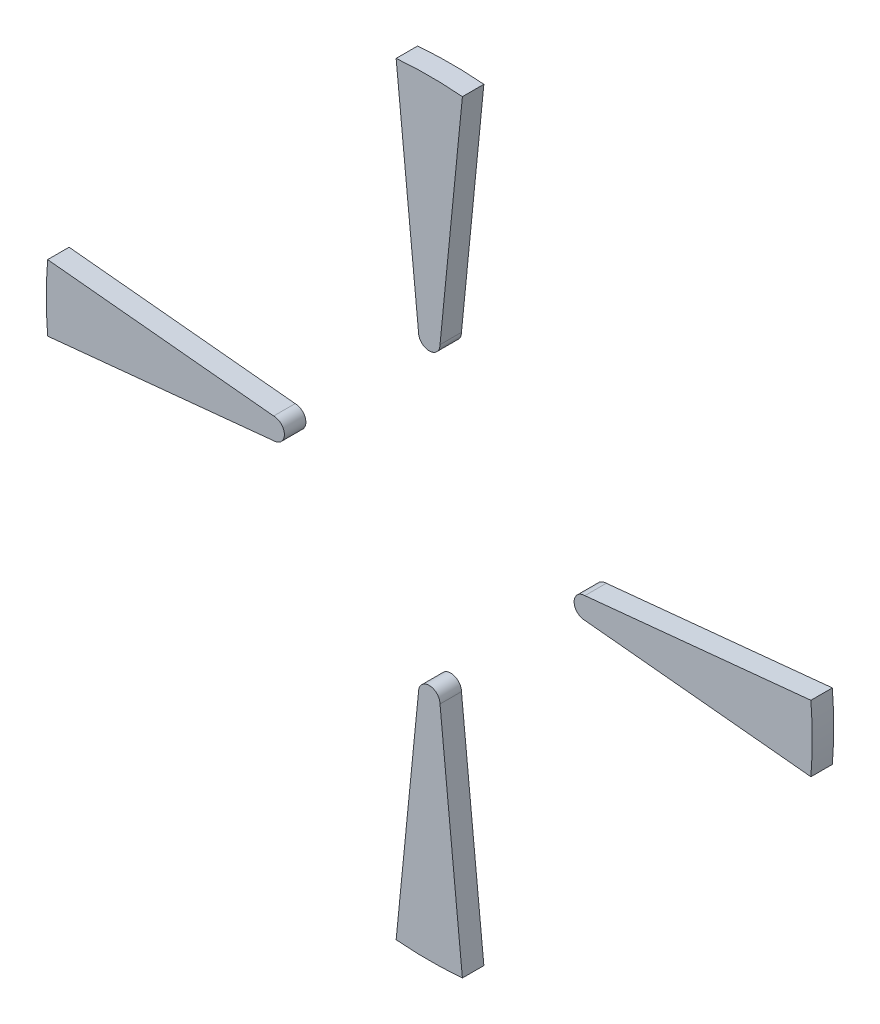
ISO-10303-21;
HEADER;
FILE_DESCRIPTION(('STEP AP214'),'2;1');
FILE_NAME('part.step','',(''),(''),'','','');
FILE_SCHEMA(('AUTOMOTIVE_DESIGN { 1 0 10303 214 1 1 1 1 }'));
ENDSEC;
DATA;
#1=APPLICATION_CONTEXT('core data for automotive mechanical design processes');
#2=APPLICATION_PROTOCOL_DEFINITION('international standard','automotive_design',2000,#1);
#3=PRODUCT_CONTEXT('',#1,'mechanical');
#4=PRODUCT('Part','Part','',(#3));
#5=PRODUCT_RELATED_PRODUCT_CATEGORY('part','',(#4));
#6=PRODUCT_DEFINITION_FORMATION('','',#4);
#7=PRODUCT_DEFINITION_CONTEXT('part definition',#1,'design');
#8=PRODUCT_DEFINITION('design','',#6,#7);
#9=PRODUCT_DEFINITION_SHAPE('','',#8);
#10=(LENGTH_UNIT() NAMED_UNIT(*) SI_UNIT(.MILLI.,.METRE.));
#11=(NAMED_UNIT(*) PLANE_ANGLE_UNIT() SI_UNIT($,.RADIAN.));
#12=(NAMED_UNIT(*) SI_UNIT($,.STERADIAN.) SOLID_ANGLE_UNIT());
#13=UNCERTAINTY_MEASURE_WITH_UNIT(LENGTH_MEASURE(1.E-05),#10,'distance_accuracy_value','');
#14=(GEOMETRIC_REPRESENTATION_CONTEXT(3) GLOBAL_UNCERTAINTY_ASSIGNED_CONTEXT((#13)) GLOBAL_UNIT_ASSIGNED_CONTEXT((#10,
#11,#12)) REPRESENTATION_CONTEXT('',''));
#15=CARTESIAN_POINT('',(0.,0.,0.));
#16=DIRECTION('',(0.,0.,1.));
#17=DIRECTION('',(1.,0.,0.));
#18=AXIS2_PLACEMENT_3D('',#15,#16,#17);
#19=CARTESIAN_POINT('',(0.00128687487735684,-0.0129845408163198,0.06));
#20=DIRECTION('',(-0.0986250457590006,0.995124665732407,0.));
#21=DIRECTION('',(-0.995124665732407,-0.0986250457590006,0.));
#22=AXIS2_PLACEMENT_3D('',#19,#20,#21);
#23=PLANE('',#22);
#24=DIRECTION('',(0.995124665732407,0.0986250457590006,0.));
#25=VECTOR('',#24,1.);
#26=CARTESIAN_POINT('',(0.00128687487735684,-0.0129845408163198,0.));
#27=LINE('',#26,#25);
#28=CARTESIAN_POINT('',(0.434999999999999,0.0299999999999985,0.));
#29=VERTEX_POINT('',#28);
#30=CARTESIAN_POINT('',(1.06700404554806,0.0926368032654223,0.));
#31=VERTEX_POINT('',#30);
#32=EDGE_CURVE('E113',#29,#31,#27,.T.);
#33=ORIENTED_EDGE('',*,*,#32,.F.);
#34=DIRECTION('',(0.,0.,-1.));
#35=VECTOR('',#34,1.);
#36=CARTESIAN_POINT('',(0.434999999999999,0.0299999999999985,0.06));
#37=LINE('',#36,#35);
#38=CARTESIAN_POINT('',(0.434999999999999,0.0299999999999985,0.06));
#39=VERTEX_POINT('',#38);
#40=EDGE_CURVE('E12',#39,#29,#37,.T.);
#41=ORIENTED_EDGE('',*,*,#40,.F.);
#42=DIRECTION('',(0.995124665732407,0.0986250457590006,0.));
#43=VECTOR('',#42,1.);
#44=CARTESIAN_POINT('',(0.00128687487735684,-0.0129845408163198,0.06));
#45=LINE('',#44,#43);
#46=CARTESIAN_POINT('',(1.06700404554806,0.0926368032654223,0.06));
#47=VERTEX_POINT('',#46);
#48=EDGE_CURVE('E101',#39,#47,#45,.T.);
#49=ORIENTED_EDGE('',*,*,#48,.T.);
#50=DIRECTION('',(0.,0.,-1.));
#51=VECTOR('',#50,1.);
#52=CARTESIAN_POINT('',(1.06700404554806,0.0926368032654223,0.06));
#53=LINE('',#52,#51);
#54=EDGE_CURVE('E90',#47,#31,#53,.T.);
#55=ORIENTED_EDGE('',*,*,#54,.T.);
#56=EDGE_LOOP('',(#33,#41,#49,#55));
#57=FACE_BOUND('',#56,.T.);
#58=ADVANCED_FACE('F51',(#57),#23,.T.);
#59=CARTESIAN_POINT('',(0.434999999999999,0.,0.06));
#60=DIRECTION('',(0.,0.,-1.));
#61=DIRECTION('',(-1.,0.,0.));
#62=AXIS2_PLACEMENT_3D('',#59,#60,#61);
#63=CYLINDRICAL_SURFACE('',#62,0.03);
#64=CARTESIAN_POINT('',(0.434999999999999,0.,0.));
#65=DIRECTION('',(0.,0.,1.));
#66=DIRECTION('',(1.,0.,0.));
#67=AXIS2_PLACEMENT_3D('',#64,#65,#66);
#68=CIRCLE('',#67,0.03);
#69=CARTESIAN_POINT('',(0.434999999999999,-0.0300000000000015,0.));
#70=VERTEX_POINT('',#69);
#71=EDGE_CURVE('E106',#29,#70,#68,.T.);
#72=ORIENTED_EDGE('',*,*,#71,.T.);
#73=DIRECTION('',(0.,0.,-1.));
#74=VECTOR('',#73,1.);
#75=CARTESIAN_POINT('',(0.434999999999999,-0.0300000000000015,0.06));
#76=LINE('',#75,#74);
#77=CARTESIAN_POINT('',(0.434999999999999,-0.0300000000000015,0.06));
#78=VERTEX_POINT('',#77);
#79=EDGE_CURVE('E59',#78,#70,#76,.T.);
#80=ORIENTED_EDGE('',*,*,#79,.F.);
#81=CARTESIAN_POINT('',(0.434999999999999,0.,0.06));
#82=DIRECTION('',(0.,0.,1.));
#83=DIRECTION('',(1.,0.,0.));
#84=AXIS2_PLACEMENT_3D('',#81,#82,#83);
#85=CIRCLE('',#84,0.03);
#86=EDGE_CURVE('E96',#39,#78,#85,.T.);
#87=ORIENTED_EDGE('',*,*,#86,.F.);
#88=ORIENTED_EDGE('',*,*,#40,.T.);
#89=EDGE_LOOP('',(#72,#80,#87,#88));
#90=FACE_BOUND('',#89,.T.);
#91=ADVANCED_FACE('F104',(#90),#63,.T.);
#92=CARTESIAN_POINT('',(0.00128687487735693,0.0129845408163198,0.06));
#93=DIRECTION('',(0.0986250457590075,0.995124665732406,0.));
#94=DIRECTION('',(-0.995124665732407,0.0986250457590076,0.));
#95=AXIS2_PLACEMENT_3D('',#92,#93,#94);
#96=PLANE('',#95);
#97=DIRECTION('',(0.995124665732407,-0.0986250457590076,0.));
#98=VECTOR('',#97,1.);
#99=CARTESIAN_POINT('',(0.00128687487735693,0.0129845408163198,0.));
#100=LINE('',#99,#98);
#101=CARTESIAN_POINT('',(1.06700404554806,-0.0926368032654298,0.));
#102=VERTEX_POINT('',#101);
#103=EDGE_CURVE('E83',#70,#102,#100,.T.);
#104=ORIENTED_EDGE('',*,*,#103,.T.);
#105=DIRECTION('',(0.,0.,-1.));
#106=VECTOR('',#105,1.);
#107=CARTESIAN_POINT('',(1.06700404554806,-0.0926368032654298,0.06));
#108=LINE('',#107,#106);
#109=CARTESIAN_POINT('',(1.06700404554806,-0.0926368032654298,0.06));
#110=VERTEX_POINT('',#109);
#111=EDGE_CURVE('E107',#110,#102,#108,.T.);
#112=ORIENTED_EDGE('',*,*,#111,.F.);
#113=DIRECTION('',(0.995124665732407,-0.0986250457590076,0.));
#114=VECTOR('',#113,1.);
#115=CARTESIAN_POINT('',(0.00128687487735693,0.0129845408163198,0.06));
#116=LINE('',#115,#114);
#117=EDGE_CURVE('E100',#78,#110,#116,.T.);
#118=ORIENTED_EDGE('',*,*,#117,.F.);
#119=ORIENTED_EDGE('',*,*,#79,.T.);
#120=EDGE_LOOP('',(#104,#112,#118,#119));
#121=FACE_BOUND('',#120,.T.);
#122=ADVANCED_FACE('F108',(#121),#96,.F.);
#123=CARTESIAN_POINT('',(0.,0.,0.06));
#124=DIRECTION('',(0.,0.,-1.));
#125=DIRECTION('',(-1.,0.,0.));
#126=AXIS2_PLACEMENT_3D('',#123,#124,#125);
#127=CYLINDRICAL_SURFACE('',#126,1.07101783857001);
#128=CARTESIAN_POINT('',(0.,0.,0.));
#129=DIRECTION('',(0.,0.,1.));
#130=DIRECTION('',(1.,0.,0.));
#131=AXIS2_PLACEMENT_3D('',#128,#129,#130);
#132=CIRCLE('',#131,1.07101783857001);
#133=EDGE_CURVE('E118',#102,#31,#132,.T.);
#134=ORIENTED_EDGE('',*,*,#133,.T.);
#135=ORIENTED_EDGE('',*,*,#54,.F.);
#136=CARTESIAN_POINT('',(0.,0.,0.06));
#137=DIRECTION('',(0.,0.,1.));
#138=DIRECTION('',(1.,0.,0.));
#139=AXIS2_PLACEMENT_3D('',#136,#137,#138);
#140=CIRCLE('',#139,1.07101783857001);
#141=EDGE_CURVE('E67',#110,#47,#140,.T.);
#142=ORIENTED_EDGE('',*,*,#141,.F.);
#143=ORIENTED_EDGE('',*,*,#111,.T.);
#144=EDGE_LOOP('',(#134,#135,#142,#143));
#145=FACE_BOUND('',#144,.T.);
#146=ADVANCED_FACE('F123',(#145),#127,.T.);
#147=CARTESIAN_POINT('',(0.,0.,0.06));
#148=DIRECTION('',(0.,0.,1.));
#149=DIRECTION('',(1.,0.,0.));
#150=AXIS2_PLACEMENT_3D('',#147,#148,#149);
#151=PLANE('',#150);
#152=ORIENTED_EDGE('',*,*,#48,.F.);
#153=ORIENTED_EDGE('',*,*,#86,.T.);
#154=ORIENTED_EDGE('',*,*,#117,.T.);
#155=ORIENTED_EDGE('',*,*,#141,.T.);
#156=EDGE_LOOP('',(#152,#153,#154,#155));
#157=FACE_BOUND('',#156,.T.);
#158=ADVANCED_FACE('F98',(#157),#151,.T.);
#159=CARTESIAN_POINT('',(0.,0.,0.));
#160=DIRECTION('',(0.,0.,1.));
#161=DIRECTION('',(1.,0.,0.));
#162=AXIS2_PLACEMENT_3D('',#159,#160,#161);
#163=PLANE('',#162);
#164=ORIENTED_EDGE('',*,*,#32,.T.);
#165=ORIENTED_EDGE('',*,*,#133,.F.);
#166=ORIENTED_EDGE('',*,*,#103,.F.);
#167=ORIENTED_EDGE('',*,*,#71,.F.);
#168=EDGE_LOOP('',(#164,#165,#166,#167));
#169=FACE_BOUND('',#168,.T.);
#170=ADVANCED_FACE('F125',(#169),#163,.F.);
#171=CLOSED_SHELL('',(#58,#91,#122,#146,#158,#170));
#172=MANIFOLD_SOLID_BREP('B2',#171);
#173=CARTESIAN_POINT('',(-0.0129845408163198,-0.00128687487735679,0.06));
#174=DIRECTION('',(0.995124665732408,0.0986250457589971,0.));
#175=DIRECTION('',(-0.0986250457589971,0.995124665732408,0.));
#176=AXIS2_PLACEMENT_3D('',#173,#174,#175);
#177=PLANE('',#176);
#178=DIRECTION('',(0.0986250457589971,-0.995124665732408,0.));
#179=VECTOR('',#178,1.);
#180=CARTESIAN_POINT('',(-0.0129845408163198,-0.00128687487735679,0.));
#181=LINE('',#180,#179);
#182=CARTESIAN_POINT('',(0.0299999999999969,-0.434999999999999,0.));
#183=VERTEX_POINT('',#182);
#184=CARTESIAN_POINT('',(0.0926368032654186,-1.06700404554806,0.));
#185=VERTEX_POINT('',#184);
#186=EDGE_CURVE('E258',#183,#185,#181,.T.);
#187=ORIENTED_EDGE('',*,*,#186,.F.);
#188=DIRECTION('',(0.,0.,-1.));
#189=VECTOR('',#188,1.);
#190=CARTESIAN_POINT('',(0.0299999999999969,-0.434999999999999,0.06));
#191=LINE('',#190,#189);
#192=CARTESIAN_POINT('',(0.0299999999999969,-0.434999999999999,0.06));
#193=VERTEX_POINT('',#192);
#194=EDGE_CURVE('E49',#193,#183,#191,.T.);
#195=ORIENTED_EDGE('',*,*,#194,.F.);
#196=DIRECTION('',(0.0986250457589971,-0.995124665732408,0.));
#197=VECTOR('',#196,1.);
#198=CARTESIAN_POINT('',(-0.0129845408163198,-0.00128687487735679,0.06));
#199=LINE('',#198,#197);
#200=CARTESIAN_POINT('',(0.0926368032654186,-1.06700404554806,0.06));
#201=VERTEX_POINT('',#200);
#202=EDGE_CURVE('E246',#193,#201,#199,.T.);
#203=ORIENTED_EDGE('',*,*,#202,.T.);
#204=DIRECTION('',(0.,0.,-1.));
#205=VECTOR('',#204,1.);
#206=CARTESIAN_POINT('',(0.0926368032654186,-1.06700404554806,0.06));
#207=LINE('',#206,#205);
#208=EDGE_CURVE('E235',#201,#185,#207,.T.);
#209=ORIENTED_EDGE('',*,*,#208,.T.);
#210=EDGE_LOOP('',(#187,#195,#203,#209));
#211=FACE_BOUND('',#210,.T.);
#212=ADVANCED_FACE('F196',(#211),#177,.T.);
#213=CARTESIAN_POINT('',(0.,-0.434999999999999,0.06));
#214=DIRECTION('',(0.,0.,-1.));
#215=DIRECTION('',(-1.,0.,0.));
#216=AXIS2_PLACEMENT_3D('',#213,#214,#215);
#217=CYLINDRICAL_SURFACE('',#216,0.03);
#218=CARTESIAN_POINT('',(0.,-0.434999999999999,0.));
#219=DIRECTION('',(0.,0.,1.));
#220=DIRECTION('',(1.,0.,0.));
#221=AXIS2_PLACEMENT_3D('',#218,#219,#220);
#222=CIRCLE('',#221,0.03);
#223=CARTESIAN_POINT('',(-0.030000000000003,-0.434999999999999,0.));
#224=VERTEX_POINT('',#223);
#225=EDGE_CURVE('E251',#183,#224,#222,.T.);
#226=ORIENTED_EDGE('',*,*,#225,.T.);
#227=DIRECTION('',(0.,0.,-1.));
#228=VECTOR('',#227,1.);
#229=CARTESIAN_POINT('',(-0.030000000000003,-0.434999999999999,0.06));
#230=LINE('',#229,#228);
#231=CARTESIAN_POINT('',(-0.030000000000003,-0.434999999999999,0.06));
#232=VERTEX_POINT('',#231);
#233=EDGE_CURVE('E204',#232,#224,#230,.T.);
#234=ORIENTED_EDGE('',*,*,#233,.F.);
#235=CARTESIAN_POINT('',(0.,-0.434999999999999,0.06));
#236=DIRECTION('',(0.,0.,1.));
#237=DIRECTION('',(1.,0.,0.));
#238=AXIS2_PLACEMENT_3D('',#235,#236,#237);
#239=CIRCLE('',#238,0.03);
#240=EDGE_CURVE('E241',#193,#232,#239,.T.);
#241=ORIENTED_EDGE('',*,*,#240,.F.);
#242=ORIENTED_EDGE('',*,*,#194,.T.);
#243=EDGE_LOOP('',(#226,#234,#241,#242));
#244=FACE_BOUND('',#243,.T.);
#245=ADVANCED_FACE('F249',(#244),#217,.T.);
#246=CARTESIAN_POINT('',(0.0129845408163198,-0.00128687487735697,0.06));
#247=DIRECTION('',(0.995124665732406,-0.098625045759011,0.));
#248=DIRECTION('',(0.0986250457590111,0.995124665732406,0.));
#249=AXIS2_PLACEMENT_3D('',#246,#247,#248);
#250=PLANE('',#249);
#251=DIRECTION('',(-0.098625045759011,-0.995124665732406,0.));
#252=VECTOR('',#251,1.);
#253=CARTESIAN_POINT('',(0.0129845408163198,-0.00128687487735697,0.));
#254=LINE('',#253,#252);
#255=CARTESIAN_POINT('',(-0.0926368032654335,-1.06700404554806,0.));
#256=VERTEX_POINT('',#255);
#257=EDGE_CURVE('E228',#224,#256,#254,.T.);
#258=ORIENTED_EDGE('',*,*,#257,.T.);
#259=DIRECTION('',(0.,0.,-1.));
#260=VECTOR('',#259,1.);
#261=CARTESIAN_POINT('',(-0.0926368032654335,-1.06700404554806,0.06));
#262=LINE('',#261,#260);
#263=CARTESIAN_POINT('',(-0.0926368032654335,-1.06700404554806,0.06));
#264=VERTEX_POINT('',#263);
#265=EDGE_CURVE('E252',#264,#256,#262,.T.);
#266=ORIENTED_EDGE('',*,*,#265,.F.);
#267=DIRECTION('',(-0.098625045759011,-0.995124665732406,0.));
#268=VECTOR('',#267,1.);
#269=CARTESIAN_POINT('',(0.0129845408163198,-0.00128687487735697,0.06));
#270=LINE('',#269,#268);
#271=EDGE_CURVE('E245',#232,#264,#270,.T.);
#272=ORIENTED_EDGE('',*,*,#271,.F.);
#273=ORIENTED_EDGE('',*,*,#233,.T.);
#274=EDGE_LOOP('',(#258,#266,#272,#273));
#275=FACE_BOUND('',#274,.T.);
#276=ADVANCED_FACE('F253',(#275),#250,.F.);
#277=CARTESIAN_POINT('',(0.,0.,0.06));
#278=DIRECTION('',(0.,0.,-1.));
#279=DIRECTION('',(-1.,0.,0.));
#280=AXIS2_PLACEMENT_3D('',#277,#278,#279);
#281=CYLINDRICAL_SURFACE('',#280,1.07101783857001);
#282=CARTESIAN_POINT('',(0.,0.,0.));
#283=DIRECTION('',(0.,0.,1.));
#284=DIRECTION('',(1.,0.,0.));
#285=AXIS2_PLACEMENT_3D('',#282,#283,#284);
#286=CIRCLE('',#285,1.07101783857001);
#287=EDGE_CURVE('E263',#256,#185,#286,.T.);
#288=ORIENTED_EDGE('',*,*,#287,.T.);
#289=ORIENTED_EDGE('',*,*,#208,.F.);
#290=CARTESIAN_POINT('',(0.,0.,0.06));
#291=DIRECTION('',(0.,0.,1.));
#292=DIRECTION('',(1.,0.,0.));
#293=AXIS2_PLACEMENT_3D('',#290,#291,#292);
#294=CIRCLE('',#293,1.07101783857001);
#295=EDGE_CURVE('E212',#264,#201,#294,.T.);
#296=ORIENTED_EDGE('',*,*,#295,.F.);
#297=ORIENTED_EDGE('',*,*,#265,.T.);
#298=EDGE_LOOP('',(#288,#289,#296,#297));
#299=FACE_BOUND('',#298,.T.);
#300=ADVANCED_FACE('F268',(#299),#281,.T.);
#301=CARTESIAN_POINT('',(0.,0.,0.06));
#302=DIRECTION('',(0.,0.,1.));
#303=DIRECTION('',(1.,0.,0.));
#304=AXIS2_PLACEMENT_3D('',#301,#302,#303);
#305=PLANE('',#304);
#306=ORIENTED_EDGE('',*,*,#202,.F.);
#307=ORIENTED_EDGE('',*,*,#240,.T.);
#308=ORIENTED_EDGE('',*,*,#271,.T.);
#309=ORIENTED_EDGE('',*,*,#295,.T.);
#310=EDGE_LOOP('',(#306,#307,#308,#309));
#311=FACE_BOUND('',#310,.T.);
#312=ADVANCED_FACE('F243',(#311),#305,.T.);
#313=CARTESIAN_POINT('',(0.,0.,0.));
#314=DIRECTION('',(0.,0.,1.));
#315=DIRECTION('',(1.,0.,0.));
#316=AXIS2_PLACEMENT_3D('',#313,#314,#315);
#317=PLANE('',#316);
#318=ORIENTED_EDGE('',*,*,#186,.T.);
#319=ORIENTED_EDGE('',*,*,#287,.F.);
#320=ORIENTED_EDGE('',*,*,#257,.F.);
#321=ORIENTED_EDGE('',*,*,#225,.F.);
#322=EDGE_LOOP('',(#318,#319,#320,#321));
#323=FACE_BOUND('',#322,.T.);
#324=ADVANCED_FACE('F270',(#323),#317,.F.);
#325=CLOSED_SHELL('',(#212,#245,#276,#300,#312,#324));
#326=MANIFOLD_SOLID_BREP('B6',#325);
#327=CARTESIAN_POINT('',(-0.434999999999999,0.,0.06));
#328=DIRECTION('',(0.,0.,-1.));
#329=DIRECTION('',(-1.,0.,0.));
#330=AXIS2_PLACEMENT_3D('',#327,#328,#329);
#331=CYLINDRICAL_SURFACE('',#330,0.03);
#332=CARTESIAN_POINT('',(-0.434999999999999,0.,0.));
#333=DIRECTION('',(0.,0.,1.));
#334=DIRECTION('',(1.,0.,0.));
#335=AXIS2_PLACEMENT_3D('',#332,#333,#334);
#336=CIRCLE('',#335,0.03);
#337=CARTESIAN_POINT('',(-0.434999999999999,-0.0299999999999954,0.));
#338=VERTEX_POINT('',#337);
#339=CARTESIAN_POINT('',(-0.434999999999999,0.0300000000000045,0.));
#340=VERTEX_POINT('',#339);
#341=EDGE_CURVE('E403',#338,#340,#336,.T.);
#342=ORIENTED_EDGE('',*,*,#341,.T.);
#343=DIRECTION('',(0.,0.,-1.));
#344=VECTOR('',#343,1.);
#345=CARTESIAN_POINT('',(-0.434999999999999,0.0300000000000045,0.06));
#346=LINE('',#345,#344);
#347=CARTESIAN_POINT('',(-0.434999999999999,0.0300000000000045,0.06));
#348=VERTEX_POINT('',#347);
#349=EDGE_CURVE('E194',#348,#340,#346,.T.);
#350=ORIENTED_EDGE('',*,*,#349,.F.);
#351=CARTESIAN_POINT('',(-0.434999999999999,0.,0.06));
#352=DIRECTION('',(0.,0.,1.));
#353=DIRECTION('',(1.,0.,0.));
#354=AXIS2_PLACEMENT_3D('',#351,#352,#353);
#355=CIRCLE('',#354,0.03);
#356=CARTESIAN_POINT('',(-0.434999999999999,-0.0299999999999954,0.06));
#357=VERTEX_POINT('',#356);
#358=EDGE_CURVE('E389',#357,#348,#355,.T.);
#359=ORIENTED_EDGE('',*,*,#358,.F.);
#360=DIRECTION('',(0.,0.,-1.));
#361=VECTOR('',#360,1.);
#362=CARTESIAN_POINT('',(-0.434999999999999,-0.0299999999999954,0.06));
#363=LINE('',#362,#361);
#364=EDGE_CURVE('E356',#357,#338,#363,.T.);
#365=ORIENTED_EDGE('',*,*,#364,.T.);
#366=EDGE_LOOP('',(#342,#350,#359,#365));
#367=FACE_BOUND('',#366,.T.);
#368=ADVANCED_FACE('F340',(#367),#331,.T.);
#369=CARTESIAN_POINT('',(-0.00128687487735702,-0.0129845408163198,0.06));
#370=DIRECTION('',(-0.0986250457590145,-0.995124665732406,0.));
#371=DIRECTION('',(0.995124665732406,-0.0986250457590145,0.));
#372=AXIS2_PLACEMENT_3D('',#369,#370,#371);
#373=PLANE('',#372);
#374=DIRECTION('',(-0.995124665732406,0.0986250457590145,0.));
#375=VECTOR('',#374,1.);
#376=CARTESIAN_POINT('',(-0.00128687487735702,-0.0129845408163198,0.));
#377=LINE('',#376,#375);
#378=CARTESIAN_POINT('',(-1.06700404554806,0.0926368032654372,0.));
#379=VERTEX_POINT('',#378);
#380=EDGE_CURVE('E394',#340,#379,#377,.T.);
#381=ORIENTED_EDGE('',*,*,#380,.T.);
#382=DIRECTION('',(0.,0.,-1.));
#383=VECTOR('',#382,1.);
#384=CARTESIAN_POINT('',(-1.06700404554806,0.0926368032654372,0.06));
#385=LINE('',#384,#383);
#386=CARTESIAN_POINT('',(-1.06700404554806,0.0926368032654372,0.06));
#387=VERTEX_POINT('',#386);
#388=EDGE_CURVE('E348',#387,#379,#385,.T.);
#389=ORIENTED_EDGE('',*,*,#388,.F.);
#390=DIRECTION('',(-0.995124665732406,0.0986250457590145,0.));
#391=VECTOR('',#390,1.);
#392=CARTESIAN_POINT('',(-0.00128687487735702,-0.0129845408163198,0.06));
#393=LINE('',#392,#391);
#394=EDGE_CURVE('E382',#348,#387,#393,.T.);
#395=ORIENTED_EDGE('',*,*,#394,.F.);
#396=ORIENTED_EDGE('',*,*,#349,.T.);
#397=EDGE_LOOP('',(#381,#389,#395,#396));
#398=FACE_BOUND('',#397,.T.);
#399=ADVANCED_FACE('F393',(#398),#373,.F.);
#400=CARTESIAN_POINT('',(0.,0.,0.06));
#401=DIRECTION('',(0.,0.,-1.));
#402=DIRECTION('',(-1.,0.,0.));
#403=AXIS2_PLACEMENT_3D('',#400,#401,#402);
#404=CYLINDRICAL_SURFACE('',#403,1.07101783857001);
#405=CARTESIAN_POINT('',(0.,0.,0.));
#406=DIRECTION('',(0.,0.,1.));
#407=DIRECTION('',(1.,0.,0.));
#408=AXIS2_PLACEMENT_3D('',#405,#406,#407);
#409=CIRCLE('',#408,1.07101783857001);
#410=CARTESIAN_POINT('',(-1.06700404554806,-0.0926368032654148,0.));
#411=VERTEX_POINT('',#410);
#412=EDGE_CURVE('E406',#379,#411,#409,.T.);
#413=ORIENTED_EDGE('',*,*,#412,.T.);
#414=DIRECTION('',(0.,0.,-1.));
#415=VECTOR('',#414,1.);
#416=CARTESIAN_POINT('',(-1.06700404554806,-0.0926368032654148,0.06));
#417=LINE('',#416,#415);
#418=CARTESIAN_POINT('',(-1.06700404554806,-0.0926368032654148,0.06));
#419=VERTEX_POINT('',#418);
#420=EDGE_CURVE('E371',#419,#411,#417,.T.);
#421=ORIENTED_EDGE('',*,*,#420,.F.);
#422=CARTESIAN_POINT('',(0.,0.,0.06));
#423=DIRECTION('',(0.,0.,1.));
#424=DIRECTION('',(1.,0.,0.));
#425=AXIS2_PLACEMENT_3D('',#422,#423,#424);
#426=CIRCLE('',#425,1.07101783857001);
#427=EDGE_CURVE('E388',#387,#419,#426,.T.);
#428=ORIENTED_EDGE('',*,*,#427,.F.);
#429=ORIENTED_EDGE('',*,*,#388,.T.);
#430=EDGE_LOOP('',(#413,#421,#428,#429));
#431=FACE_BOUND('',#430,.T.);
#432=ADVANCED_FACE('F397',(#431),#404,.T.);
#433=CARTESIAN_POINT('',(-0.00128687487735675,0.0129845408163198,0.06));
#434=DIRECTION('',(0.0986250457589937,-0.995124665732408,0.));
#435=DIRECTION('',(0.995124665732408,0.0986250457589937,0.));
#436=AXIS2_PLACEMENT_3D('',#433,#434,#435);
#437=PLANE('',#436);
#438=DIRECTION('',(-0.995124665732408,-0.0986250457589937,0.));
#439=VECTOR('',#438,1.);
#440=CARTESIAN_POINT('',(-0.00128687487735675,0.0129845408163198,0.));
#441=LINE('',#440,#439);
#442=EDGE_CURVE('E408',#338,#411,#441,.T.);
#443=ORIENTED_EDGE('',*,*,#442,.F.);
#444=ORIENTED_EDGE('',*,*,#364,.F.);
#445=DIRECTION('',(-0.995124665732408,-0.0986250457589937,0.));
#446=VECTOR('',#445,1.);
#447=CARTESIAN_POINT('',(-0.00128687487735675,0.0129845408163198,0.06));
#448=LINE('',#447,#446);
#449=EDGE_CURVE('E398',#357,#419,#448,.T.);
#450=ORIENTED_EDGE('',*,*,#449,.T.);
#451=ORIENTED_EDGE('',*,*,#420,.T.);
#452=EDGE_LOOP('',(#443,#444,#450,#451));
#453=FACE_BOUND('',#452,.T.);
#454=ADVANCED_FACE('F414',(#453),#437,.T.);
#455=CARTESIAN_POINT('',(0.,0.,0.06));
#456=DIRECTION('',(0.,0.,1.));
#457=DIRECTION('',(1.,0.,0.));
#458=AXIS2_PLACEMENT_3D('',#455,#456,#457);
#459=PLANE('',#458);
#460=ORIENTED_EDGE('',*,*,#358,.T.);
#461=ORIENTED_EDGE('',*,*,#394,.T.);
#462=ORIENTED_EDGE('',*,*,#427,.T.);
#463=ORIENTED_EDGE('',*,*,#449,.F.);
#464=EDGE_LOOP('',(#460,#461,#462,#463));
#465=FACE_BOUND('',#464,.T.);
#466=ADVANCED_FACE('F385',(#465),#459,.T.);
#467=CARTESIAN_POINT('',(0.,0.,0.));
#468=DIRECTION('',(0.,0.,1.));
#469=DIRECTION('',(1.,0.,0.));
#470=AXIS2_PLACEMENT_3D('',#467,#468,#469);
#471=PLANE('',#470);
#472=ORIENTED_EDGE('',*,*,#341,.F.);
#473=ORIENTED_EDGE('',*,*,#442,.T.);
#474=ORIENTED_EDGE('',*,*,#412,.F.);
#475=ORIENTED_EDGE('',*,*,#380,.F.);
#476=EDGE_LOOP('',(#472,#473,#474,#475));
#477=FACE_BOUND('',#476,.T.);
#478=ADVANCED_FACE('F413',(#477),#471,.F.);
#479=CLOSED_SHELL('',(#368,#399,#432,#454,#466,#478));
#480=MANIFOLD_SOLID_BREP('B43',#479);
#481=CARTESIAN_POINT('',(0.,0.434999999999999,0.06));
#482=DIRECTION('',(0.,0.,-1.));
#483=DIRECTION('',(-1.,0.,0.));
#484=AXIS2_PLACEMENT_3D('',#481,#482,#483);
#485=CYLINDRICAL_SURFACE('',#484,0.03);
#486=CARTESIAN_POINT('',(0.,0.434999999999999,0.));
#487=DIRECTION('',(0.,0.,1.));
#488=DIRECTION('',(1.,0.,0.));
#489=AXIS2_PLACEMENT_3D('',#486,#487,#488);
#490=CIRCLE('',#489,0.03);
#491=CARTESIAN_POINT('',(-0.03,0.434999999999999,0.));
#492=VERTEX_POINT('',#491);
#493=CARTESIAN_POINT('',(0.03,0.434999999999999,0.));
#494=VERTEX_POINT('',#493);
#495=EDGE_CURVE('E538',#492,#494,#490,.T.);
#496=ORIENTED_EDGE('',*,*,#495,.T.);
#497=DIRECTION('',(0.,0.,-1.));
#498=VECTOR('',#497,1.);
#499=CARTESIAN_POINT('',(0.03,0.434999999999999,0.06));
#500=LINE('',#499,#498);
#501=CARTESIAN_POINT('',(0.03,0.434999999999999,0.06));
#502=VERTEX_POINT('',#501);
#503=EDGE_CURVE('E338',#502,#494,#500,.T.);
#504=ORIENTED_EDGE('',*,*,#503,.F.);
#505=CARTESIAN_POINT('',(0.,0.434999999999999,0.06));
#506=DIRECTION('',(0.,0.,1.));
#507=DIRECTION('',(1.,0.,0.));
#508=AXIS2_PLACEMENT_3D('',#505,#506,#507);
#509=CIRCLE('',#508,0.03);
#510=CARTESIAN_POINT('',(-0.03,0.434999999999999,0.06));
#511=VERTEX_POINT('',#510);
#512=EDGE_CURVE('E524',#511,#502,#509,.T.);
#513=ORIENTED_EDGE('',*,*,#512,.F.);
#514=DIRECTION('',(0.,0.,-1.));
#515=VECTOR('',#514,1.);
#516=CARTESIAN_POINT('',(-0.03,0.434999999999999,0.06));
#517=LINE('',#516,#515);
#518=EDGE_CURVE('E491',#511,#492,#517,.T.);
#519=ORIENTED_EDGE('',*,*,#518,.T.);
#520=EDGE_LOOP('',(#496,#504,#513,#519));
#521=FACE_BOUND('',#520,.T.);
#522=ADVANCED_FACE('F475',(#521),#485,.T.);
#523=CARTESIAN_POINT('',(-0.0129845408163198,0.00128687487735688,0.06));
#524=DIRECTION('',(-0.995124665732407,0.0986250457590041,0.));
#525=DIRECTION('',(-0.0986250457590041,-0.995124665732407,0.));
#526=AXIS2_PLACEMENT_3D('',#523,#524,#525);
#527=PLANE('',#526);
#528=DIRECTION('',(0.0986250457590041,0.995124665732407,0.));
#529=VECTOR('',#528,1.);
#530=CARTESIAN_POINT('',(-0.0129845408163198,0.00128687487735688,0.));
#531=LINE('',#530,#529);
#532=CARTESIAN_POINT('',(0.092636803265426,1.06700404554806,0.));
#533=VERTEX_POINT('',#532);
#534=EDGE_CURVE('E529',#494,#533,#531,.T.);
#535=ORIENTED_EDGE('',*,*,#534,.T.);
#536=DIRECTION('',(0.,0.,-1.));
#537=VECTOR('',#536,1.);
#538=CARTESIAN_POINT('',(0.092636803265426,1.06700404554806,0.06));
#539=LINE('',#538,#537);
#540=CARTESIAN_POINT('',(0.092636803265426,1.06700404554806,0.06));
#541=VERTEX_POINT('',#540);
#542=EDGE_CURVE('E483',#541,#533,#539,.T.);
#543=ORIENTED_EDGE('',*,*,#542,.F.);
#544=DIRECTION('',(0.0986250457590041,0.995124665732407,0.));
#545=VECTOR('',#544,1.);
#546=CARTESIAN_POINT('',(-0.0129845408163198,0.00128687487735688,0.06));
#547=LINE('',#546,#545);
#548=EDGE_CURVE('E517',#502,#541,#547,.T.);
#549=ORIENTED_EDGE('',*,*,#548,.F.);
#550=ORIENTED_EDGE('',*,*,#503,.T.);
#551=EDGE_LOOP('',(#535,#543,#549,#550));
#552=FACE_BOUND('',#551,.T.);
#553=ADVANCED_FACE('F528',(#552),#527,.F.);
#554=CARTESIAN_POINT('',(0.,0.,0.06));
#555=DIRECTION('',(0.,0.,-1.));
#556=DIRECTION('',(-1.,0.,0.));
#557=AXIS2_PLACEMENT_3D('',#554,#555,#556);
#558=CYLINDRICAL_SURFACE('',#557,1.07101783857001);
#559=CARTESIAN_POINT('',(0.,0.,0.));
#560=DIRECTION('',(0.,0.,1.));
#561=DIRECTION('',(1.,0.,0.));
#562=AXIS2_PLACEMENT_3D('',#559,#560,#561);
#563=CIRCLE('',#562,1.07101783857001);
#564=CARTESIAN_POINT('',(-0.092636803265426,1.06700404554806,0.));
#565=VERTEX_POINT('',#564);
#566=EDGE_CURVE('E541',#533,#565,#563,.T.);
#567=ORIENTED_EDGE('',*,*,#566,.T.);
#568=DIRECTION('',(0.,0.,-1.));
#569=VECTOR('',#568,1.);
#570=CARTESIAN_POINT('',(-0.092636803265426,1.06700404554806,0.06));
#571=LINE('',#570,#569);
#572=CARTESIAN_POINT('',(-0.092636803265426,1.06700404554806,0.06));
#573=VERTEX_POINT('',#572);
#574=EDGE_CURVE('E506',#573,#565,#571,.T.);
#575=ORIENTED_EDGE('',*,*,#574,.F.);
#576=CARTESIAN_POINT('',(0.,0.,0.06));
#577=DIRECTION('',(0.,0.,1.));
#578=DIRECTION('',(1.,0.,0.));
#579=AXIS2_PLACEMENT_3D('',#576,#577,#578);
#580=CIRCLE('',#579,1.07101783857001);
#581=EDGE_CURVE('E523',#541,#573,#580,.T.);
#582=ORIENTED_EDGE('',*,*,#581,.F.);
#583=ORIENTED_EDGE('',*,*,#542,.T.);
#584=EDGE_LOOP('',(#567,#575,#582,#583));
#585=FACE_BOUND('',#584,.T.);
#586=ADVANCED_FACE('F532',(#585),#558,.T.);
#587=CARTESIAN_POINT('',(0.0129845408163198,0.00128687487735688,0.06));
#588=DIRECTION('',(-0.995124665732407,-0.0986250457590041,0.));
#589=DIRECTION('',(0.0986250457590041,-0.995124665732407,0.));
#590=AXIS2_PLACEMENT_3D('',#587,#588,#589);
#591=PLANE('',#590);
#592=DIRECTION('',(-0.0986250457590041,0.995124665732407,0.));
#593=VECTOR('',#592,1.);
#594=CARTESIAN_POINT('',(0.0129845408163198,0.00128687487735688,0.));
#595=LINE('',#594,#593);
#596=EDGE_CURVE('E543',#492,#565,#595,.T.);
#597=ORIENTED_EDGE('',*,*,#596,.F.);
#598=ORIENTED_EDGE('',*,*,#518,.F.);
#599=DIRECTION('',(-0.0986250457590041,0.995124665732407,0.));
#600=VECTOR('',#599,1.);
#601=CARTESIAN_POINT('',(0.0129845408163198,0.00128687487735688,0.06));
#602=LINE('',#601,#600);
#603=EDGE_CURVE('E533',#511,#573,#602,.T.);
#604=ORIENTED_EDGE('',*,*,#603,.T.);
#605=ORIENTED_EDGE('',*,*,#574,.T.);
#606=EDGE_LOOP('',(#597,#598,#604,#605));
#607=FACE_BOUND('',#606,.T.);
#608=ADVANCED_FACE('F549',(#607),#591,.T.);
#609=CARTESIAN_POINT('',(0.,0.,0.06));
#610=DIRECTION('',(0.,0.,1.));
#611=DIRECTION('',(1.,0.,0.));
#612=AXIS2_PLACEMENT_3D('',#609,#610,#611);
#613=PLANE('',#612);
#614=ORIENTED_EDGE('',*,*,#512,.T.);
#615=ORIENTED_EDGE('',*,*,#548,.T.);
#616=ORIENTED_EDGE('',*,*,#581,.T.);
#617=ORIENTED_EDGE('',*,*,#603,.F.);
#618=EDGE_LOOP('',(#614,#615,#616,#617));
#619=FACE_BOUND('',#618,.T.);
#620=ADVANCED_FACE('F520',(#619),#613,.T.);
#621=CARTESIAN_POINT('',(0.,0.,0.));
#622=DIRECTION('',(0.,0.,1.));
#623=DIRECTION('',(1.,0.,0.));
#624=AXIS2_PLACEMENT_3D('',#621,#622,#623);
#625=PLANE('',#624);
#626=ORIENTED_EDGE('',*,*,#495,.F.);
#627=ORIENTED_EDGE('',*,*,#596,.T.);
#628=ORIENTED_EDGE('',*,*,#566,.F.);
#629=ORIENTED_EDGE('',*,*,#534,.F.);
#630=EDGE_LOOP('',(#626,#627,#628,#629));
#631=FACE_BOUND('',#630,.T.);
#632=ADVANCED_FACE('F548',(#631),#625,.F.);
#633=CLOSED_SHELL('',(#522,#553,#586,#608,#620,#632));
#634=MANIFOLD_SOLID_BREP('B188',#633);
#635=ADVANCED_BREP_SHAPE_REPRESENTATION('',(#18,#172,#326,#480,#634),#14);
#636=SHAPE_DEFINITION_REPRESENTATION(#9,#635);
ENDSEC;
END-ISO-10303-21;
